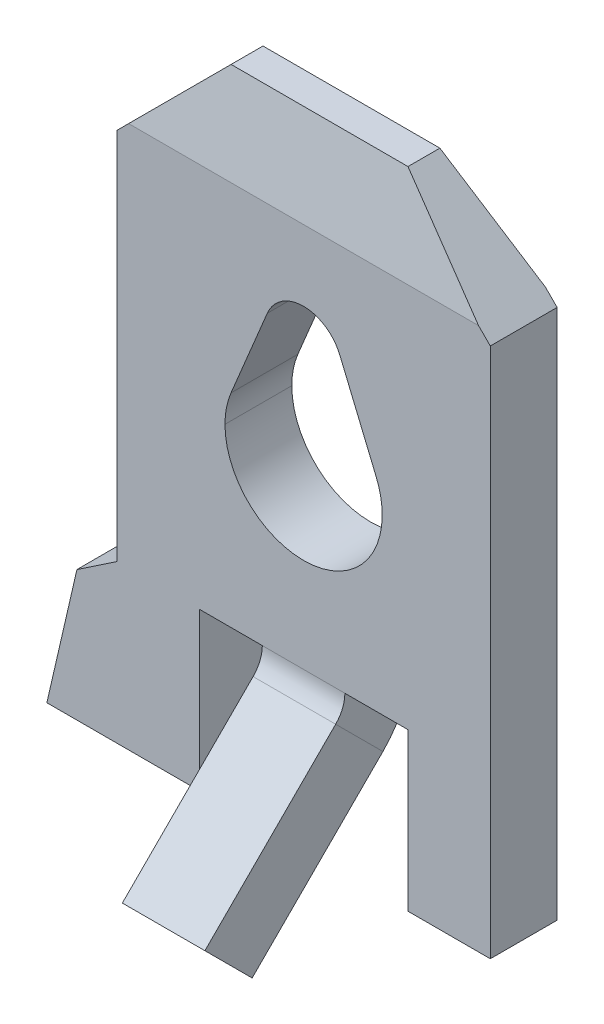
ISO-10303-21;
HEADER;
FILE_DESCRIPTION(('STEP AP214'),'2;1');
FILE_NAME('part.step','',(''),(''),'','','');
FILE_SCHEMA(('AUTOMOTIVE_DESIGN { 1 0 10303 214 1 1 1 1 }'));
ENDSEC;
DATA;
#1=APPLICATION_CONTEXT('core data for automotive mechanical design processes');
#2=APPLICATION_PROTOCOL_DEFINITION('international standard','automotive_design',2000,#1);
#3=PRODUCT_CONTEXT('',#1,'mechanical');
#4=PRODUCT('Part','Part','',(#3));
#5=PRODUCT_RELATED_PRODUCT_CATEGORY('part','',(#4));
#6=PRODUCT_DEFINITION_FORMATION('','',#4);
#7=PRODUCT_DEFINITION_CONTEXT('part definition',#1,'design');
#8=PRODUCT_DEFINITION('design','',#6,#7);
#9=PRODUCT_DEFINITION_SHAPE('','',#8);
#10=(LENGTH_UNIT() NAMED_UNIT(*) SI_UNIT(.MILLI.,.METRE.));
#11=(NAMED_UNIT(*) PLANE_ANGLE_UNIT() SI_UNIT($,.RADIAN.));
#12=(NAMED_UNIT(*) SI_UNIT($,.STERADIAN.) SOLID_ANGLE_UNIT());
#13=UNCERTAINTY_MEASURE_WITH_UNIT(LENGTH_MEASURE(1.E-05),#10,'distance_accuracy_value','');
#14=(GEOMETRIC_REPRESENTATION_CONTEXT(3) GLOBAL_UNCERTAINTY_ASSIGNED_CONTEXT((#13)) GLOBAL_UNIT_ASSIGNED_CONTEXT((#10,
#11,#12)) REPRESENTATION_CONTEXT('',''));
#15=CARTESIAN_POINT('',(0.,0.,0.));
#16=DIRECTION('',(0.,0.,1.));
#17=DIRECTION('',(1.,0.,0.));
#18=AXIS2_PLACEMENT_3D('',#15,#16,#17);
#19=CARTESIAN_POINT('',(0.,2.15,-2.18923148483106));
#20=DIRECTION('',(-0.557844868525012,0.829945240760083,0.));
#21=DIRECTION('',(0.,0.,1.));
#22=AXIS2_PLACEMENT_3D('',#19,#20,#21);
#23=PLANE('',#22);
#24=DIRECTION('',(0.829945240760083,0.557844868525012,0.));
#25=VECTOR('',#24,1.);
#26=CARTESIAN_POINT('',(0.,2.15,0.));
#27=LINE('',#26,#25);
#28=CARTESIAN_POINT('',(-0.507898340442458,1.80861785930754,0.));
#29=VERTEX_POINT('',#28);
#30=CARTESIAN_POINT('',(0.,2.15,0.));
#31=VERTEX_POINT('',#30);
#32=EDGE_CURVE('E388',#29,#31,#27,.T.);
#33=ORIENTED_EDGE('',*,*,#32,.F.);
#34=DIRECTION('',(0.,0.,1.));
#35=VECTOR('',#34,1.);
#36=CARTESIAN_POINT('',(-0.507898340442458,1.80861785930754,-2.18923148483106));
#37=LINE('',#36,#35);
#38=CARTESIAN_POINT('',(-0.507898340442458,1.80861785930754,0.85));
#39=VERTEX_POINT('',#38);
#40=EDGE_CURVE('E11',#29,#39,#37,.T.);
#41=ORIENTED_EDGE('',*,*,#40,.T.);
#42=DIRECTION('',(-0.829945240760083,-0.557844868525012,0.));
#43=VECTOR('',#42,1.);
#44=CARTESIAN_POINT('',(0.,2.15,0.85));
#45=LINE('',#44,#43);
#46=CARTESIAN_POINT('',(0.,2.15,0.85));
#47=VERTEX_POINT('',#46);
#48=EDGE_CURVE('E365',#47,#39,#45,.T.);
#49=ORIENTED_EDGE('',*,*,#48,.F.);
#50=DIRECTION('',(0.,0.,1.));
#51=VECTOR('',#50,1.);
#52=CARTESIAN_POINT('',(0.,2.15,-2.18923148483106));
#53=LINE('',#52,#51);
#54=EDGE_CURVE('E271',#31,#47,#53,.T.);
#55=ORIENTED_EDGE('',*,*,#54,.F.);
#56=EDGE_LOOP('',(#33,#41,#49,#55));
#57=FACE_BOUND('',#56,.T.);
#58=ADVANCED_FACE('F16',(#57),#23,.T.);
#59=CARTESIAN_POINT('',(-0.507898340442458,1.80861785930754,-2.18923148483106));
#60=DIRECTION('',(-0.974429787531596,0.224692209858572,0.));
#61=DIRECTION('',(0.,0.,1.));
#62=AXIS2_PLACEMENT_3D('',#59,#60,#61);
#63=PLANE('',#62);
#64=DIRECTION('',(0.224692209858572,0.974429787531596,0.));
#65=VECTOR('',#64,1.);
#66=CARTESIAN_POINT('',(-0.507898340442458,1.80861785930754,0.));
#67=LINE('',#66,#65);
#68=CARTESIAN_POINT('',(-0.890356386047537,0.149999999999998,0.));
#69=VERTEX_POINT('',#68);
#70=EDGE_CURVE('E384',#69,#29,#67,.T.);
#71=ORIENTED_EDGE('',*,*,#70,.F.);
#72=DIRECTION('',(0.,0.,1.));
#73=VECTOR('',#72,1.);
#74=CARTESIAN_POINT('',(-0.890356386047537,0.149999999999998,-2.18923148483106));
#75=LINE('',#74,#73);
#76=CARTESIAN_POINT('',(-0.890356386047537,0.149999999999998,0.85));
#77=VERTEX_POINT('',#76);
#78=EDGE_CURVE('E305',#69,#77,#75,.T.);
#79=ORIENTED_EDGE('',*,*,#78,.T.);
#80=DIRECTION('',(-0.224692209858572,-0.974429787531596,0.));
#81=VECTOR('',#80,1.);
#82=CARTESIAN_POINT('',(-0.507898340442458,1.80861785930754,0.85));
#83=LINE('',#82,#81);
#84=EDGE_CURVE('E360',#39,#77,#83,.T.);
#85=ORIENTED_EDGE('',*,*,#84,.F.);
#86=ORIENTED_EDGE('',*,*,#40,.F.);
#87=EDGE_LOOP('',(#71,#79,#85,#86));
#88=FACE_BOUND('',#87,.T.);
#89=ADVANCED_FACE('F1168',(#88),#63,.T.);
#90=CARTESIAN_POINT('',(2.9,3.84848421169575,2.03213960570058));
#91=DIRECTION('',(-1.,0.,0.));
#92=DIRECTION('',(0.,0.,1.));
#93=AXIS2_PLACEMENT_3D('',#90,#91,#92);
#94=PLANE('',#93);
#95=DIRECTION('',(0.,-0.707106781186544,-0.707106781186551));
#96=VECTOR('',#95,1.);
#97=CARTESIAN_POINT('',(2.9,3.39031190869815,2.49031190869817));
#98=LINE('',#97,#96);
#99=CARTESIAN_POINT('',(2.9,1.86715728752538,0.96715728752538));
#100=VERTEX_POINT('',#99);
#101=CARTESIAN_POINT('',(2.9,1.26611652351681,0.366116523516817));
#102=VERTEX_POINT('',#101);
#103=EDGE_CURVE('E298',#100,#102,#98,.T.);
#104=ORIENTED_EDGE('',*,*,#103,.F.);
#105=DIRECTION('',(0.,-0.707106781186547,0.707106781186549));
#106=VECTOR('',#105,1.);
#107=CARTESIAN_POINT('',(2.9,2.32532959052296,0.508984984527799));
#108=LINE('',#107,#106);
#109=CARTESIAN_POINT('',(2.9,0.204009246963322,2.63030532808745));
#110=VERTEX_POINT('',#109);
#111=EDGE_CURVE('E379',#100,#110,#108,.T.);
#112=ORIENTED_EDGE('',*,*,#111,.T.);
#113=DIRECTION('',(0.,0.707106781186549,0.707106781186546));
#114=VECTOR('',#113,1.);
#115=CARTESIAN_POINT('',(2.9,-0.397031517045243,2.02926456407888));
#116=LINE('',#115,#114);
#117=CARTESIAN_POINT('',(2.9,-0.397031517045243,2.02926456407888));
#118=VERTEX_POINT('',#117);
#119=EDGE_CURVE('E417',#118,#110,#116,.T.);
#120=ORIENTED_EDGE('',*,*,#119,.F.);
#121=DIRECTION('',(0.,0.707106781186547,-0.707106781186549));
#122=VECTOR('',#121,1.);
#123=CARTESIAN_POINT('',(2.9,1.72428882651439,-0.0920557794807646));
#124=LINE('',#123,#122);
#125=EDGE_CURVE('E27',#118,#102,#124,.T.);
#126=ORIENTED_EDGE('',*,*,#125,.T.);
#127=EDGE_LOOP('',(#104,#112,#120,#126));
#128=FACE_BOUND('',#127,.T.);
#129=ADVANCED_FACE('F1173',(#128),#94,.F.);
#130=CARTESIAN_POINT('',(4.75,0.310075264141302,1.32215778289233));
#131=DIRECTION('',(0.,0.707106781186549,0.707106781186547));
#132=DIRECTION('',(1.,0.,0.));
#133=AXIS2_PLACEMENT_3D('',#130,#131,#132);
#134=PLANE('',#133);
#135=DIRECTION('',(-1.,0.,0.));
#136=VECTOR('',#135,1.);
#137=CARTESIAN_POINT('',(4.75,1.26611652351682,0.366116523516815));
#138=LINE('',#137,#136);
#139=CARTESIAN_POINT('',(1.85,1.26611652351682,0.366116523516817));
#140=VERTEX_POINT('',#139);
#141=EDGE_CURVE('E489',#102,#140,#138,.T.);
#142=ORIENTED_EDGE('',*,*,#141,.F.);
#143=ORIENTED_EDGE('',*,*,#125,.F.);
#144=DIRECTION('',(1.,0.,0.));
#145=VECTOR('',#144,1.);
#146=CARTESIAN_POINT('',(1.85,-0.397031517045243,2.02926456407888));
#147=LINE('',#146,#145);
#148=CARTESIAN_POINT('',(1.85,-0.397031517045243,2.02926456407888));
#149=VERTEX_POINT('',#148);
#150=EDGE_CURVE('E503',#149,#118,#147,.T.);
#151=ORIENTED_EDGE('',*,*,#150,.F.);
#152=DIRECTION('',(0.,-0.707106781186547,0.707106781186549));
#153=VECTOR('',#152,1.);
#154=CARTESIAN_POINT('',(1.85,1.72428882651439,-0.0920557794807644));
#155=LINE('',#154,#153);
#156=EDGE_CURVE('E42',#140,#149,#155,.T.);
#157=ORIENTED_EDGE('',*,*,#156,.F.);
#158=EDGE_LOOP('',(#142,#143,#151,#157));
#159=FACE_BOUND('',#158,.T.);
#160=ADVANCED_FACE('F1187',(#159),#134,.F.);
#161=CARTESIAN_POINT('',(1.85,3.84848421169575,2.03213960570058));
#162=DIRECTION('',(1.,0.,0.));
#163=DIRECTION('',(0.,0.,-1.));
#164=AXIS2_PLACEMENT_3D('',#161,#162,#163);
#165=PLANE('',#164);
#166=DIRECTION('',(0.,0.707106781186544,0.707106781186551));
#167=VECTOR('',#166,1.);
#168=CARTESIAN_POINT('',(1.85,3.39031190869815,2.49031190869817));
#169=LINE('',#168,#167);
#170=CARTESIAN_POINT('',(1.85,1.86715728752538,0.967157287525381));
#171=VERTEX_POINT('',#170);
#172=EDGE_CURVE('E376',#140,#171,#169,.T.);
#173=ORIENTED_EDGE('',*,*,#172,.F.);
#174=ORIENTED_EDGE('',*,*,#156,.T.);
#175=DIRECTION('',(0.,-0.707106781186549,-0.707106781186546));
#176=VECTOR('',#175,1.);
#177=CARTESIAN_POINT('',(1.85,0.204009246963322,2.63030532808745));
#178=LINE('',#177,#176);
#179=CARTESIAN_POINT('',(1.85,0.204009246963322,2.63030532808745));
#180=VERTEX_POINT('',#179);
#181=EDGE_CURVE('E416',#180,#149,#178,.T.);
#182=ORIENTED_EDGE('',*,*,#181,.F.);
#183=DIRECTION('',(0.,0.707106781186547,-0.707106781186549));
#184=VECTOR('',#183,1.);
#185=CARTESIAN_POINT('',(1.85,2.32532959052296,0.5089849845278));
#186=LINE('',#185,#184);
#187=EDGE_CURVE('E504',#180,#171,#186,.T.);
#188=ORIENTED_EDGE('',*,*,#187,.T.);
#189=EDGE_LOOP('',(#173,#174,#182,#188));
#190=FACE_BOUND('',#189,.T.);
#191=ADVANCED_FACE('F561',(#190),#165,.F.);
#192=CARTESIAN_POINT('',(4.75,5.79015281833704,-2.95583824328629));
#193=DIRECTION('',(0.,-0.707106781186549,-0.707106781186547));
#194=DIRECTION('',(0.,0.707106781186547,-0.707106781186549));
#195=AXIS2_PLACEMENT_3D('',#192,#193,#194);
#196=PLANE('',#195);
#197=DIRECTION('',(1.,0.,0.));
#198=VECTOR('',#197,1.);
#199=CARTESIAN_POINT('',(4.75,1.86715728752538,0.967157287525383));
#200=LINE('',#199,#198);
#201=EDGE_CURVE('E488',#171,#100,#200,.T.);
#202=ORIENTED_EDGE('',*,*,#201,.F.);
#203=ORIENTED_EDGE('',*,*,#187,.F.);
#204=DIRECTION('',(-1.,0.,0.));
#205=VECTOR('',#204,1.);
#206=CARTESIAN_POINT('',(2.9,0.204009246963322,2.63030532808745));
#207=LINE('',#206,#205);
#208=EDGE_CURVE('E412',#110,#180,#207,.T.);
#209=ORIENTED_EDGE('',*,*,#208,.F.);
#210=ORIENTED_EDGE('',*,*,#111,.F.);
#211=EDGE_LOOP('',(#202,#203,#209,#210));
#212=FACE_BOUND('',#211,.T.);
#213=ADVANCED_FACE('F565',(#212),#196,.F.);
#214=CARTESIAN_POINT('',(0.,-0.397031517045243,2.02926456407888));
#215=DIRECTION('',(0.,-0.707106781186546,0.707106781186549));
#216=DIRECTION('',(-1.,0.,0.));
#217=AXIS2_PLACEMENT_3D('',#214,#215,#216);
#218=PLANE('',#217);
#219=ORIENTED_EDGE('',*,*,#119,.T.);
#220=ORIENTED_EDGE('',*,*,#208,.T.);
#221=ORIENTED_EDGE('',*,*,#181,.T.);
#222=ORIENTED_EDGE('',*,*,#150,.T.);
#223=EDGE_LOOP('',(#219,#220,#221,#222));
#224=FACE_BOUND('',#223,.T.);
#225=ADVANCED_FACE('F1180',(#224),#218,.T.);
#226=CARTESIAN_POINT('',(0.876719746353102,2.15,1.25));
#227=DIRECTION('',(1.,0.,0.));
#228=DIRECTION('',(0.,1.,0.));
#229=AXIS2_PLACEMENT_3D('',#226,#227,#228);
#230=CYLINDRICAL_SURFACE('',#229,1.25);
#231=CARTESIAN_POINT('',(2.9,2.15,1.25));
#232=DIRECTION('',(1.,0.,0.));
#233=DIRECTION('',(0.,1.,0.));
#234=AXIS2_PLACEMENT_3D('',#231,#232,#233);
#235=CIRCLE('',#234,1.25);
#236=CARTESIAN_POINT('',(2.9,2.15,0.));
#237=VERTEX_POINT('',#236);
#238=EDGE_CURVE('E404',#102,#237,#235,.T.);
#239=ORIENTED_EDGE('',*,*,#238,.F.);
#240=ORIENTED_EDGE('',*,*,#141,.T.);
#241=CARTESIAN_POINT('',(1.85,2.15,1.25));
#242=DIRECTION('',(-1.,0.,0.));
#243=DIRECTION('',(0.,1.,0.));
#244=AXIS2_PLACEMENT_3D('',#241,#242,#243);
#245=CIRCLE('',#244,1.25);
#246=CARTESIAN_POINT('',(1.85,2.15,0.));
#247=VERTEX_POINT('',#246);
#248=EDGE_CURVE('E372',#247,#140,#245,.T.);
#249=ORIENTED_EDGE('',*,*,#248,.F.);
#250=DIRECTION('',(-1.,0.,0.));
#251=VECTOR('',#250,1.);
#252=CARTESIAN_POINT('',(4.75,2.15,0.));
#253=LINE('',#252,#251);
#254=EDGE_CURVE('E499',#237,#247,#253,.T.);
#255=ORIENTED_EDGE('',*,*,#254,.F.);
#256=EDGE_LOOP('',(#239,#240,#249,#255));
#257=FACE_BOUND('',#256,.T.);
#258=ADVANCED_FACE('F1183',(#257),#230,.T.);
#259=CARTESIAN_POINT('',(0.876719746353102,2.15,1.25));
#260=DIRECTION('',(1.,0.,0.));
#261=DIRECTION('',(0.,1.,0.));
#262=AXIS2_PLACEMENT_3D('',#259,#260,#261);
#263=CYLINDRICAL_SURFACE('',#262,0.4);
#264=CARTESIAN_POINT('',(2.9,2.15,1.25));
#265=DIRECTION('',(1.,0.,0.));
#266=DIRECTION('',(0.,0.,1.));
#267=AXIS2_PLACEMENT_3D('',#264,#265,#266);
#268=CIRCLE('',#267,0.4);
#269=CARTESIAN_POINT('',(2.9,2.15,0.85));
#270=VERTEX_POINT('',#269);
#271=EDGE_CURVE('E406',#100,#270,#268,.T.);
#272=ORIENTED_EDGE('',*,*,#271,.T.);
#273=DIRECTION('',(1.,0.,0.));
#274=VECTOR('',#273,1.);
#275=CARTESIAN_POINT('',(4.75,2.15,0.85));
#276=LINE('',#275,#274);
#277=CARTESIAN_POINT('',(1.85,2.15,0.85));
#278=VERTEX_POINT('',#277);
#279=EDGE_CURVE('E340',#278,#270,#276,.T.);
#280=ORIENTED_EDGE('',*,*,#279,.F.);
#281=CARTESIAN_POINT('',(1.85,2.15,1.25));
#282=DIRECTION('',(-1.,0.,0.));
#283=DIRECTION('',(0.,1.,0.));
#284=AXIS2_PLACEMENT_3D('',#281,#282,#283);
#285=CIRCLE('',#284,0.4);
#286=EDGE_CURVE('E550',#278,#171,#285,.T.);
#287=ORIENTED_EDGE('',*,*,#286,.T.);
#288=ORIENTED_EDGE('',*,*,#201,.T.);
#289=EDGE_LOOP('',(#272,#280,#287,#288));
#290=FACE_BOUND('',#289,.T.);
#291=ADVANCED_FACE('F569',(#290),#263,.F.);
#292=CARTESIAN_POINT('',(2.9,2.15,1.25));
#293=DIRECTION('',(-1.,0.,0.));
#294=DIRECTION('',(0.,0.,1.));
#295=AXIS2_PLACEMENT_3D('',#292,#293,#294);
#296=PLANE('',#295);
#297=ORIENTED_EDGE('',*,*,#103,.T.);
#298=ORIENTED_EDGE('',*,*,#238,.T.);
#299=DIRECTION('',(0.,0.,-1.));
#300=VECTOR('',#299,1.);
#301=CARTESIAN_POINT('',(2.9,2.15,3.0040659228538));
#302=LINE('',#301,#300);
#303=EDGE_CURVE('E371',#270,#237,#302,.T.);
#304=ORIENTED_EDGE('',*,*,#303,.F.);
#305=ORIENTED_EDGE('',*,*,#271,.F.);
#306=EDGE_LOOP('',(#297,#298,#304,#305));
#307=FACE_BOUND('',#306,.T.);
#308=ADVANCED_FACE('F1177',(#307),#296,.F.);
#309=CARTESIAN_POINT('',(1.85,2.15,1.25));
#310=DIRECTION('',(1.,0.,0.));
#311=DIRECTION('',(0.,-1.,0.));
#312=AXIS2_PLACEMENT_3D('',#309,#310,#311);
#313=PLANE('',#312);
#314=DIRECTION('',(0.,0.,-1.));
#315=VECTOR('',#314,1.);
#316=CARTESIAN_POINT('',(1.85,2.15,3.0040659228538));
#317=LINE('',#316,#315);
#318=EDGE_CURVE('E370',#278,#247,#317,.T.);
#319=ORIENTED_EDGE('',*,*,#318,.T.);
#320=ORIENTED_EDGE('',*,*,#248,.T.);
#321=ORIENTED_EDGE('',*,*,#172,.T.);
#322=ORIENTED_EDGE('',*,*,#286,.F.);
#323=EDGE_LOOP('',(#319,#320,#321,#322));
#324=FACE_BOUND('',#323,.T.);
#325=ADVANCED_FACE('F558',(#324),#313,.F.);
#326=CARTESIAN_POINT('',(1.05,2.15,3.0040659228538));
#327=DIRECTION('',(-1.,0.,0.));
#328=DIRECTION('',(0.,0.,1.));
#329=AXIS2_PLACEMENT_3D('',#326,#327,#328);
#330=PLANE('',#329);
#331=DIRECTION('',(0.,-1.,0.));
#332=VECTOR('',#331,1.);
#333=CARTESIAN_POINT('',(1.05,2.15,0.85));
#334=LINE('',#333,#332);
#335=CARTESIAN_POINT('',(1.05,2.15,0.85));
#336=VERTEX_POINT('',#335);
#337=CARTESIAN_POINT('',(1.05,0.15,0.85));
#338=VERTEX_POINT('',#337);
#339=EDGE_CURVE('E434',#336,#338,#334,.T.);
#340=ORIENTED_EDGE('',*,*,#339,.T.);
#341=DIRECTION('',(0.,0.,-1.));
#342=VECTOR('',#341,1.);
#343=CARTESIAN_POINT('',(1.05,0.149999999999999,3.0040659228538));
#344=LINE('',#343,#342);
#345=CARTESIAN_POINT('',(1.05,0.15,0.));
#346=VERTEX_POINT('',#345);
#347=EDGE_CURVE('E310',#338,#346,#344,.T.);
#348=ORIENTED_EDGE('',*,*,#347,.T.);
#349=DIRECTION('',(0.,1.,0.));
#350=VECTOR('',#349,1.);
#351=CARTESIAN_POINT('',(1.05,2.15,0.));
#352=LINE('',#351,#350);
#353=CARTESIAN_POINT('',(1.05,2.15,0.));
#354=VERTEX_POINT('',#353);
#355=EDGE_CURVE('E510',#346,#354,#352,.T.);
#356=ORIENTED_EDGE('',*,*,#355,.T.);
#357=DIRECTION('',(0.,0.,-1.));
#358=VECTOR('',#357,1.);
#359=CARTESIAN_POINT('',(1.05,2.15,3.0040659228538));
#360=LINE('',#359,#358);
#361=EDGE_CURVE('E366',#336,#354,#360,.T.);
#362=ORIENTED_EDGE('',*,*,#361,.F.);
#363=EDGE_LOOP('',(#340,#348,#356,#362));
#364=FACE_BOUND('',#363,.T.);
#365=ADVANCED_FACE('F1225',(#364),#330,.F.);
#366=CARTESIAN_POINT('',(1.85,2.15,3.0040659228538));
#367=DIRECTION('',(0.,1.,0.));
#368=DIRECTION('',(0.,0.,-1.));
#369=AXIS2_PLACEMENT_3D('',#366,#367,#368);
#370=PLANE('',#369);
#371=DIRECTION('',(-1.,0.,0.));
#372=VECTOR('',#371,1.);
#373=CARTESIAN_POINT('',(1.85,2.15,0.85));
#374=LINE('',#373,#372);
#375=EDGE_CURVE('E345',#278,#336,#374,.T.);
#376=ORIENTED_EDGE('',*,*,#375,.T.);
#377=ORIENTED_EDGE('',*,*,#361,.T.);
#378=DIRECTION('',(1.,0.,0.));
#379=VECTOR('',#378,1.);
#380=CARTESIAN_POINT('',(1.85,2.15,0.));
#381=LINE('',#380,#379);
#382=EDGE_CURVE('E513',#354,#247,#381,.T.);
#383=ORIENTED_EDGE('',*,*,#382,.T.);
#384=ORIENTED_EDGE('',*,*,#318,.F.);
#385=EDGE_LOOP('',(#376,#377,#383,#384));
#386=FACE_BOUND('',#385,.T.);
#387=ADVANCED_FACE('F575',(#386),#370,.F.);
#388=CARTESIAN_POINT('',(2.9,2.15,3.0040659228538));
#389=DIRECTION('',(0.,1.,0.));
#390=DIRECTION('',(1.,0.,0.));
#391=AXIS2_PLACEMENT_3D('',#388,#389,#390);
#392=PLANE('',#391);
#393=DIRECTION('',(-1.,0.,0.));
#394=VECTOR('',#393,1.);
#395=CARTESIAN_POINT('',(2.9,2.15,0.85));
#396=LINE('',#395,#394);
#397=CARTESIAN_POINT('',(3.7,2.15,0.85));
#398=VERTEX_POINT('',#397);
#399=EDGE_CURVE('E344',#398,#270,#396,.T.);
#400=ORIENTED_EDGE('',*,*,#399,.T.);
#401=ORIENTED_EDGE('',*,*,#303,.T.);
#402=DIRECTION('',(1.,0.,0.));
#403=VECTOR('',#402,1.);
#404=CARTESIAN_POINT('',(2.9,2.15,0.));
#405=LINE('',#404,#403);
#406=CARTESIAN_POINT('',(3.7,2.15,0.));
#407=VERTEX_POINT('',#406);
#408=EDGE_CURVE('E326',#237,#407,#405,.T.);
#409=ORIENTED_EDGE('',*,*,#408,.T.);
#410=DIRECTION('',(0.,0.,-1.));
#411=VECTOR('',#410,1.);
#412=CARTESIAN_POINT('',(3.7,2.15,3.0040659228538));
#413=LINE('',#412,#411);
#414=EDGE_CURVE('E465',#398,#407,#413,.T.);
#415=ORIENTED_EDGE('',*,*,#414,.F.);
#416=EDGE_LOOP('',(#400,#401,#409,#415));
#417=FACE_BOUND('',#416,.T.);
#418=ADVANCED_FACE('F1191',(#417),#392,.F.);
#419=CARTESIAN_POINT('',(3.7,2.15,3.0040659228538));
#420=DIRECTION('',(1.,0.,0.));
#421=DIRECTION('',(0.,-1.,0.));
#422=AXIS2_PLACEMENT_3D('',#419,#420,#421);
#423=PLANE('',#422);
#424=DIRECTION('',(0.,1.,0.));
#425=VECTOR('',#424,1.);
#426=CARTESIAN_POINT('',(3.7,2.15,0.85));
#427=LINE('',#426,#425);
#428=CARTESIAN_POINT('',(3.7,0.15,0.85));
#429=VERTEX_POINT('',#428);
#430=EDGE_CURVE('E294',#429,#398,#427,.T.);
#431=ORIENTED_EDGE('',*,*,#430,.T.);
#432=ORIENTED_EDGE('',*,*,#414,.T.);
#433=DIRECTION('',(0.,-1.,0.));
#434=VECTOR('',#433,1.);
#435=CARTESIAN_POINT('',(3.7,2.15,0.));
#436=LINE('',#435,#434);
#437=CARTESIAN_POINT('',(3.7,0.15,0.));
#438=VERTEX_POINT('',#437);
#439=EDGE_CURVE('E398',#407,#438,#436,.T.);
#440=ORIENTED_EDGE('',*,*,#439,.T.);
#441=DIRECTION('',(0.,0.,-1.));
#442=VECTOR('',#441,1.);
#443=CARTESIAN_POINT('',(3.7,0.149999999999999,3.0040659228538));
#444=LINE('',#443,#442);
#445=EDGE_CURVE('E193',#429,#438,#444,.T.);
#446=ORIENTED_EDGE('',*,*,#445,.F.);
#447=EDGE_LOOP('',(#431,#432,#440,#446));
#448=FACE_BOUND('',#447,.T.);
#449=ADVANCED_FACE('F1163',(#448),#423,.F.);
#450=CARTESIAN_POINT('',(1.91346153846154,5.84230769230769,-3.44093010681705));
#451=DIRECTION('',(-0.923076923076923,0.384615384615385,0.));
#452=DIRECTION('',(0.,0.,1.));
#453=AXIS2_PLACEMENT_3D('',#450,#451,#452);
#454=PLANE('',#453);
#455=DIRECTION('',(0.384615384615385,0.923076923076923,0.));
#456=VECTOR('',#455,1.);
#457=CARTESIAN_POINT('',(1.91346153846154,5.84230769230769,0.));
#458=LINE('',#457,#456);
#459=CARTESIAN_POINT('',(1.45192307692308,4.73461538461538,0.));
#460=VERTEX_POINT('',#459);
#461=CARTESIAN_POINT('',(1.91346153846154,5.84230769230769,0.));
#462=VERTEX_POINT('',#461);
#463=EDGE_CURVE('E338',#460,#462,#458,.T.);
#464=ORIENTED_EDGE('',*,*,#463,.T.);
#465=DIRECTION('',(0.,0.,1.));
#466=VECTOR('',#465,1.);
#467=CARTESIAN_POINT('',(1.91346153846154,5.84230769230769,-3.44093010681705));
#468=LINE('',#467,#466);
#469=CARTESIAN_POINT('',(1.91346153846154,5.84230769230769,0.85));
#470=VERTEX_POINT('',#469);
#471=EDGE_CURVE('E534',#462,#470,#468,.T.);
#472=ORIENTED_EDGE('',*,*,#471,.T.);
#473=DIRECTION('',(-0.384615384615385,-0.923076923076923,0.));
#474=VECTOR('',#473,1.);
#475=CARTESIAN_POINT('',(1.91346153846154,5.84230769230769,0.85));
#476=LINE('',#475,#474);
#477=CARTESIAN_POINT('',(1.45192307692308,4.73461538461538,0.85));
#478=VERTEX_POINT('',#477);
#479=EDGE_CURVE('E438',#470,#478,#476,.T.);
#480=ORIENTED_EDGE('',*,*,#479,.T.);
#481=DIRECTION('',(0.,0.,1.));
#482=VECTOR('',#481,1.);
#483=CARTESIAN_POINT('',(1.45192307692308,4.73461538461538,-3.44093010681705));
#484=LINE('',#483,#482);
#485=EDGE_CURVE('E468',#460,#478,#484,.T.);
#486=ORIENTED_EDGE('',*,*,#485,.F.);
#487=EDGE_LOOP('',(#464,#472,#480,#486));
#488=FACE_BOUND('',#487,.T.);
#489=ADVANCED_FACE('F1144',(#488),#454,.F.);
#490=CARTESIAN_POINT('',(2.375,4.35,-3.44093010681705));
#491=DIRECTION('',(0.,0.,1.));
#492=DIRECTION('',(1.,0.,0.));
#493=AXIS2_PLACEMENT_3D('',#490,#491,#492);
#494=CYLINDRICAL_SURFACE('',#493,1.);
#495=DIRECTION('',(0.,0.,1.));
#496=VECTOR('',#495,1.);
#497=CARTESIAN_POINT('',(1.375,4.35,-3.44093010681705));
#498=LINE('',#497,#496);
#499=CARTESIAN_POINT('',(1.375,4.35,0.));
#500=VERTEX_POINT('',#499);
#501=CARTESIAN_POINT('',(1.375,4.35,0.85));
#502=VERTEX_POINT('',#501);
#503=EDGE_CURVE('E299',#500,#502,#498,.T.);
#504=ORIENTED_EDGE('',*,*,#503,.F.);
#505=CARTESIAN_POINT('',(2.375,4.35,0.));
#506=DIRECTION('',(0.,0.,-1.));
#507=DIRECTION('',(0.,-1.,0.));
#508=AXIS2_PLACEMENT_3D('',#505,#506,#507);
#509=CIRCLE('',#508,1.);
#510=EDGE_CURVE('E424',#500,#460,#509,.T.);
#511=ORIENTED_EDGE('',*,*,#510,.T.);
#512=ORIENTED_EDGE('',*,*,#485,.T.);
#513=CARTESIAN_POINT('',(2.375,4.35,0.85));
#514=DIRECTION('',(0.,0.,1.));
#515=DIRECTION('',(1.,0.,0.));
#516=AXIS2_PLACEMENT_3D('',#513,#514,#515);
#517=CIRCLE('',#516,1.);
#518=EDGE_CURVE('E239',#478,#502,#517,.T.);
#519=ORIENTED_EDGE('',*,*,#518,.T.);
#520=EDGE_LOOP('',(#504,#511,#512,#519));
#521=FACE_BOUND('',#520,.T.);
#522=ADVANCED_FACE('F1153',(#521),#494,.F.);
#523=CARTESIAN_POINT('',(2.84243697464802,5.82748992853653,-3.44093010681705));
#524=DIRECTION('',(0.922994271128755,0.384813689288075,0.));
#525=DIRECTION('',(0.,0.,-1.));
#526=AXIS2_PLACEMENT_3D('',#523,#524,#525);
#527=PLANE('',#526);
#528=DIRECTION('',(0.384813689288075,-0.922994271128755,0.));
#529=VECTOR('',#528,1.);
#530=CARTESIAN_POINT('',(2.84243697464802,5.82748992853653,0.));
#531=LINE('',#530,#529);
#532=CARTESIAN_POINT('',(2.84243697464802,5.82748992853653,0.));
#533=VERTEX_POINT('',#532);
#534=CARTESIAN_POINT('',(3.29799427112876,4.73481368928808,0.));
#535=VERTEX_POINT('',#534);
#536=EDGE_CURVE('E403',#533,#535,#531,.T.);
#537=ORIENTED_EDGE('',*,*,#536,.T.);
#538=DIRECTION('',(0.,0.,1.));
#539=VECTOR('',#538,1.);
#540=CARTESIAN_POINT('',(3.29799427112876,4.73481368928808,-3.44093010681705));
#541=LINE('',#540,#539);
#542=CARTESIAN_POINT('',(3.29799427112876,4.73481368928808,0.85));
#543=VERTEX_POINT('',#542);
#544=EDGE_CURVE('E317',#535,#543,#541,.T.);
#545=ORIENTED_EDGE('',*,*,#544,.T.);
#546=DIRECTION('',(-0.384813689288075,0.922994271128755,0.));
#547=VECTOR('',#546,1.);
#548=CARTESIAN_POINT('',(2.84243697464802,5.82748992853653,0.85));
#549=LINE('',#548,#547);
#550=CARTESIAN_POINT('',(2.84243697464802,5.82748992853653,0.85));
#551=VERTEX_POINT('',#550);
#552=EDGE_CURVE('E519',#543,#551,#549,.T.);
#553=ORIENTED_EDGE('',*,*,#552,.T.);
#554=DIRECTION('',(0.,0.,1.));
#555=VECTOR('',#554,1.);
#556=CARTESIAN_POINT('',(2.84243697464802,5.82748992853653,-3.44093010681705));
#557=LINE('',#556,#555);
#558=EDGE_CURVE('E479',#533,#551,#557,.T.);
#559=ORIENTED_EDGE('',*,*,#558,.F.);
#560=EDGE_LOOP('',(#537,#545,#553,#559));
#561=FACE_BOUND('',#560,.T.);
#562=ADVANCED_FACE('F1155',(#561),#527,.F.);
#563=CARTESIAN_POINT('',(2.375,5.65,-3.44093010681705));
#564=DIRECTION('',(0.,0.,1.));
#565=DIRECTION('',(1.,0.,0.));
#566=AXIS2_PLACEMENT_3D('',#563,#564,#565);
#567=CYLINDRICAL_SURFACE('',#566,0.5);
#568=CARTESIAN_POINT('',(2.375,5.65,0.));
#569=DIRECTION('',(0.,0.,-1.));
#570=DIRECTION('',(0.,-1.,0.));
#571=AXIS2_PLACEMENT_3D('',#568,#569,#570);
#572=CIRCLE('',#571,0.5);
#573=EDGE_CURVE('E399',#462,#533,#572,.T.);
#574=ORIENTED_EDGE('',*,*,#573,.T.);
#575=ORIENTED_EDGE('',*,*,#558,.T.);
#576=CARTESIAN_POINT('',(2.375,5.65,0.85));
#577=DIRECTION('',(0.,0.,1.));
#578=DIRECTION('',(1.,0.,0.));
#579=AXIS2_PLACEMENT_3D('',#576,#577,#578);
#580=CIRCLE('',#579,0.5);
#581=EDGE_CURVE('E475',#551,#470,#580,.T.);
#582=ORIENTED_EDGE('',*,*,#581,.T.);
#583=ORIENTED_EDGE('',*,*,#471,.F.);
#584=EDGE_LOOP('',(#574,#575,#582,#583));
#585=FACE_BOUND('',#584,.T.);
#586=ADVANCED_FACE('F1148',(#585),#567,.F.);
#587=CARTESIAN_POINT('',(3.5,8.15,-1.76776695296637));
#588=DIRECTION('',(-0.707106781186548,-0.707106781186548,0.));
#589=DIRECTION('',(-0.707106781186548,0.707106781186548,0.));
#590=AXIS2_PLACEMENT_3D('',#587,#588,#589);
#591=PLANE('',#590);
#592=DIRECTION('',(0.,0.,1.));
#593=VECTOR('',#592,1.);
#594=CARTESIAN_POINT('',(3.5,8.15,-1.76776695296637));
#595=LINE('',#594,#593);
#596=CARTESIAN_POINT('',(3.5,8.15,0.24139344262295));
#597=VERTEX_POINT('',#596);
#598=CARTESIAN_POINT('',(3.5,8.15,0.647131147540979));
#599=VERTEX_POINT('',#598);
#600=EDGE_CURVE('E352',#597,#599,#595,.T.);
#601=ORIENTED_EDGE('',*,*,#600,.T.);
#602=DIRECTION('',(-0.70116968993079,0.70116968993079,-0.12931408215937));
#603=VECTOR('',#602,1.);
#604=CARTESIAN_POINT('',(4.11454866759705,7.53545133240295,0.760470041155192));
#605=LINE('',#604,#603);
#606=CARTESIAN_POINT('',(4.6,7.05,0.85));
#607=VERTEX_POINT('',#606);
#608=EDGE_CURVE('E277',#607,#599,#605,.T.);
#609=ORIENTED_EDGE('',*,*,#608,.F.);
#610=DIRECTION('',(0.707106781186548,-0.707106781186548,0.));
#611=VECTOR('',#610,1.);
#612=CARTESIAN_POINT('',(3.5,8.15,0.85));
#613=LINE('',#612,#611);
#614=CARTESIAN_POINT('',(4.75,6.9,0.85));
#615=VERTEX_POINT('',#614);
#616=EDGE_CURVE('E274',#607,#615,#613,.T.);
#617=ORIENTED_EDGE('',*,*,#616,.T.);
#618=DIRECTION('',(0.,0.,1.));
#619=VECTOR('',#618,1.);
#620=CARTESIAN_POINT('',(4.75,6.9,-1.76776695296637));
#621=LINE('',#620,#619);
#622=CARTESIAN_POINT('',(4.75,6.9,0.));
#623=VERTEX_POINT('',#622);
#624=EDGE_CURVE('E259',#623,#615,#621,.T.);
#625=ORIENTED_EDGE('',*,*,#624,.F.);
#626=DIRECTION('',(-0.707106781186548,0.707106781186548,0.));
#627=VECTOR('',#626,1.);
#628=CARTESIAN_POINT('',(3.5,8.15,0.));
#629=LINE('',#628,#627);
#630=CARTESIAN_POINT('',(4.6,7.05,0.));
#631=VERTEX_POINT('',#630);
#632=EDGE_CURVE('E356',#623,#631,#629,.T.);
#633=ORIENTED_EDGE('',*,*,#632,.T.);
#634=DIRECTION('',(0.698744344369524,-0.698744344369524,-0.153338457091523));
#635=VECTOR('',#634,1.);
#636=CARTESIAN_POINT('',(4.67323654881826,6.97676345118174,-0.0160716569500576));
#637=LINE('',#636,#635);
#638=EDGE_CURVE('E315',#597,#631,#637,.T.);
#639=ORIENTED_EDGE('',*,*,#638,.F.);
#640=EDGE_LOOP('',(#601,#609,#617,#625,#633,#639));
#641=FACE_BOUND('',#640,.T.);
#642=ADVANCED_FACE('F276',(#641),#591,.F.);
#643=CARTESIAN_POINT('',(0.,6.9,-1.76776695296637));
#644=DIRECTION('',(0.707106781186548,-0.707106781186548,0.));
#645=DIRECTION('',(0.,0.,-1.));
#646=AXIS2_PLACEMENT_3D('',#643,#644,#645);
#647=PLANE('',#646);
#648=DIRECTION('',(-0.707106781186548,-0.707106781186548,0.));
#649=VECTOR('',#648,1.);
#650=CARTESIAN_POINT('',(0.,6.9,0.));
#651=LINE('',#650,#649);
#652=CARTESIAN_POINT('',(0.15,7.05,0.));
#653=VERTEX_POINT('',#652);
#654=CARTESIAN_POINT('',(0.,6.9,0.));
#655=VERTEX_POINT('',#654);
#656=EDGE_CURVE('E464',#653,#655,#651,.T.);
#657=ORIENTED_EDGE('',*,*,#656,.T.);
#658=DIRECTION('',(0.,0.,1.));
#659=VECTOR('',#658,1.);
#660=CARTESIAN_POINT('',(0.,6.9,-1.76776695296637));
#661=LINE('',#660,#659);
#662=CARTESIAN_POINT('',(0.,6.9,0.85));
#663=VERTEX_POINT('',#662);
#664=EDGE_CURVE('E476',#655,#663,#661,.T.);
#665=ORIENTED_EDGE('',*,*,#664,.T.);
#666=DIRECTION('',(0.707106781186548,0.707106781186548,0.));
#667=VECTOR('',#666,1.);
#668=CARTESIAN_POINT('',(0.,6.9,0.85));
#669=LINE('',#668,#667);
#670=CARTESIAN_POINT('',(0.15,7.05,0.85));
#671=VERTEX_POINT('',#670);
#672=EDGE_CURVE('E351',#663,#671,#669,.T.);
#673=ORIENTED_EDGE('',*,*,#672,.T.);
#674=DIRECTION('',(-0.70116968993079,-0.70116968993079,0.12931408215937));
#675=VECTOR('',#674,1.);
#676=CARTESIAN_POINT('',(2.97073626927174,9.87073626927174,0.329782245421185));
#677=LINE('',#676,#675);
#678=CARTESIAN_POINT('',(1.25,8.15,0.647131147540979));
#679=VERTEX_POINT('',#678);
#680=EDGE_CURVE('E355',#679,#671,#677,.T.);
#681=ORIENTED_EDGE('',*,*,#680,.F.);
#682=DIRECTION('',(0.,0.,1.));
#683=VECTOR('',#682,1.);
#684=CARTESIAN_POINT('',(1.25,8.15,-1.76776695296637));
#685=LINE('',#684,#683);
#686=CARTESIAN_POINT('',(1.25,8.15,0.24139344262295));
#687=VERTEX_POINT('',#686);
#688=EDGE_CURVE('E311',#687,#679,#685,.T.);
#689=ORIENTED_EDGE('',*,*,#688,.F.);
#690=DIRECTION('',(0.698744344369524,0.698744344369524,0.153338457091523));
#691=VECTOR('',#690,1.);
#692=CARTESIAN_POINT('',(2.39592083042662,9.29592083042662,0.492864146468432));
#693=LINE('',#692,#691);
#694=EDGE_CURVE('E309',#653,#687,#693,.T.);
#695=ORIENTED_EDGE('',*,*,#694,.F.);
#696=EDGE_LOOP('',(#657,#665,#673,#681,#689,#695));
#697=FACE_BOUND('',#696,.T.);
#698=ADVANCED_FACE('F787',(#697),#647,.F.);
#699=CARTESIAN_POINT('',(0.,0.,0.));
#700=DIRECTION('',(1.,0.,0.));
#701=DIRECTION('',(0.,1.,0.));
#702=AXIS2_PLACEMENT_3D('',#699,#700,#701);
#703=PLANE('',#702);
#704=DIRECTION('',(0.,1.,0.));
#705=VECTOR('',#704,1.);
#706=CARTESIAN_POINT('',(0.,0.15,0.));
#707=LINE('',#706,#705);
#708=EDGE_CURVE('E20',#31,#655,#707,.T.);
#709=ORIENTED_EDGE('',*,*,#708,.F.);
#710=ORIENTED_EDGE('',*,*,#54,.T.);
#711=DIRECTION('',(0.,-1.,0.));
#712=VECTOR('',#711,1.);
#713=CARTESIAN_POINT('',(0.,7.05,0.85));
#714=LINE('',#713,#712);
#715=EDGE_CURVE('E383',#663,#47,#714,.T.);
#716=ORIENTED_EDGE('',*,*,#715,.F.);
#717=ORIENTED_EDGE('',*,*,#664,.F.);
#718=EDGE_LOOP('',(#709,#710,#716,#717));
#719=FACE_BOUND('',#718,.T.);
#720=ADVANCED_FACE('F778',(#719),#703,.F.);
#721=CARTESIAN_POINT('',(4.75,0.,0.));
#722=DIRECTION('',(1.,0.,0.));
#723=DIRECTION('',(0.,1.,0.));
#724=AXIS2_PLACEMENT_3D('',#721,#722,#723);
#725=PLANE('',#724);
#726=ORIENTED_EDGE('',*,*,#624,.T.);
#727=DIRECTION('',(0.,-1.,0.));
#728=VECTOR('',#727,1.);
#729=CARTESIAN_POINT('',(4.75,7.05,0.85));
#730=LINE('',#729,#728);
#731=CARTESIAN_POINT('',(4.75,0.15,0.85));
#732=VERTEX_POINT('',#731);
#733=EDGE_CURVE('E263',#615,#732,#730,.T.);
#734=ORIENTED_EDGE('',*,*,#733,.T.);
#735=DIRECTION('',(0.,0.,-1.));
#736=VECTOR('',#735,1.);
#737=CARTESIAN_POINT('',(4.75,0.15,0.));
#738=LINE('',#737,#736);
#739=CARTESIAN_POINT('',(4.75,0.15,0.));
#740=VERTEX_POINT('',#739);
#741=EDGE_CURVE('E207',#732,#740,#738,.T.);
#742=ORIENTED_EDGE('',*,*,#741,.T.);
#743=DIRECTION('',(0.,1.,0.));
#744=VECTOR('',#743,1.);
#745=CARTESIAN_POINT('',(4.75,0.15,0.));
#746=LINE('',#745,#744);
#747=EDGE_CURVE('E266',#740,#623,#746,.T.);
#748=ORIENTED_EDGE('',*,*,#747,.T.);
#749=EDGE_LOOP('',(#726,#734,#742,#748));
#750=FACE_BOUND('',#749,.T.);
#751=ADVANCED_FACE('F261',(#750),#725,.T.);
#752=CARTESIAN_POINT('',(4.75,0.15,0.));
#753=DIRECTION('',(0.,1.,0.));
#754=DIRECTION('',(1.,0.,0.));
#755=AXIS2_PLACEMENT_3D('',#752,#753,#754);
#756=PLANE('',#755);
#757=DIRECTION('',(-1.,0.,0.));
#758=VECTOR('',#757,1.);
#759=CARTESIAN_POINT('',(4.75,0.15,0.85));
#760=LINE('',#759,#758);
#761=EDGE_CURVE('E287',#732,#429,#760,.T.);
#762=ORIENTED_EDGE('',*,*,#761,.T.);
#763=ORIENTED_EDGE('',*,*,#445,.T.);
#764=DIRECTION('',(-1.,0.,0.));
#765=VECTOR('',#764,1.);
#766=CARTESIAN_POINT('',(4.75,0.15,0.));
#767=LINE('',#766,#765);
#768=EDGE_CURVE('E394',#740,#438,#767,.T.);
#769=ORIENTED_EDGE('',*,*,#768,.F.);
#770=ORIENTED_EDGE('',*,*,#741,.F.);
#771=EDGE_LOOP('',(#762,#763,#769,#770));
#772=FACE_BOUND('',#771,.T.);
#773=ADVANCED_FACE('F1272',(#772),#756,.F.);
#774=CARTESIAN_POINT('',(4.75,8.15,0.647131147540979));
#775=DIRECTION('',(0.,-0.181367589437408,-0.983415373838371));
#776=DIRECTION('',(0.,-0.983415373838371,0.181367589437408));
#777=AXIS2_PLACEMENT_3D('',#774,#775,#776);
#778=PLANE('',#777);
#779=DIRECTION('',(-1.,0.,0.));
#780=VECTOR('',#779,1.);
#781=CARTESIAN_POINT('',(4.75,8.15,0.647131147540979));
#782=LINE('',#781,#780);
#783=EDGE_CURVE('E314',#599,#679,#782,.T.);
#784=ORIENTED_EDGE('',*,*,#783,.T.);
#785=ORIENTED_EDGE('',*,*,#680,.T.);
#786=DIRECTION('',(-1.,0.,0.));
#787=VECTOR('',#786,1.);
#788=CARTESIAN_POINT('',(4.75,7.05,0.85));
#789=LINE('',#788,#787);
#790=EDGE_CURVE('E282',#607,#671,#789,.T.);
#791=ORIENTED_EDGE('',*,*,#790,.F.);
#792=ORIENTED_EDGE('',*,*,#608,.T.);
#793=EDGE_LOOP('',(#784,#785,#791,#792));
#794=FACE_BOUND('',#793,.T.);
#795=ADVANCED_FACE('F1268',(#794),#778,.F.);
#796=CARTESIAN_POINT('',(4.75,8.15,0.24139344262295));
#797=DIRECTION('',(0.,-1.,0.));
#798=DIRECTION('',(0.,0.,-1.));
#799=AXIS2_PLACEMENT_3D('',#796,#797,#798);
#800=PLANE('',#799);
#801=DIRECTION('',(-1.,0.,0.));
#802=VECTOR('',#801,1.);
#803=CARTESIAN_POINT('',(4.75,8.15,0.24139344262295));
#804=LINE('',#803,#802);
#805=EDGE_CURVE('E392',#597,#687,#804,.T.);
#806=ORIENTED_EDGE('',*,*,#805,.T.);
#807=ORIENTED_EDGE('',*,*,#688,.T.);
#808=ORIENTED_EDGE('',*,*,#783,.F.);
#809=ORIENTED_EDGE('',*,*,#600,.F.);
#810=EDGE_LOOP('',(#806,#807,#808,#809));
#811=FACE_BOUND('',#810,.T.);
#812=ADVANCED_FACE('F1216',(#811),#800,.F.);
#813=CARTESIAN_POINT('',(4.75,7.05,0.));
#814=DIRECTION('',(0.,-0.214348018272916,0.976757353216485));
#815=DIRECTION('',(-1.,0.,0.));
#816=AXIS2_PLACEMENT_3D('',#813,#814,#815);
#817=PLANE('',#816);
#818=DIRECTION('',(-1.,0.,0.));
#819=VECTOR('',#818,1.);
#820=CARTESIAN_POINT('',(4.75,7.05,0.));
#821=LINE('',#820,#819);
#822=EDGE_CURVE('E359',#631,#653,#821,.T.);
#823=ORIENTED_EDGE('',*,*,#822,.T.);
#824=ORIENTED_EDGE('',*,*,#694,.T.);
#825=ORIENTED_EDGE('',*,*,#805,.F.);
#826=ORIENTED_EDGE('',*,*,#638,.T.);
#827=EDGE_LOOP('',(#823,#824,#825,#826));
#828=FACE_BOUND('',#827,.T.);
#829=ADVANCED_FACE('F1210',(#828),#817,.F.);
#830=CARTESIAN_POINT('',(4.75,0.15,0.));
#831=DIRECTION('',(0.,1.,0.));
#832=DIRECTION('',(1.,0.,0.));
#833=AXIS2_PLACEMENT_3D('',#830,#831,#832);
#834=PLANE('',#833);
#835=DIRECTION('',(-1.,0.,0.));
#836=VECTOR('',#835,1.);
#837=CARTESIAN_POINT('',(4.75,0.15,0.));
#838=LINE('',#837,#836);
#839=EDGE_CURVE('E389',#346,#69,#838,.T.);
#840=ORIENTED_EDGE('',*,*,#839,.F.);
#841=ORIENTED_EDGE('',*,*,#347,.F.);
#842=DIRECTION('',(-1.,0.,0.));
#843=VECTOR('',#842,1.);
#844=CARTESIAN_POINT('',(4.75,0.15,0.85));
#845=LINE('',#844,#843);
#846=EDGE_CURVE('E364',#338,#77,#845,.T.);
#847=ORIENTED_EDGE('',*,*,#846,.T.);
#848=ORIENTED_EDGE('',*,*,#78,.F.);
#849=EDGE_LOOP('',(#840,#841,#847,#848));
#850=FACE_BOUND('',#849,.T.);
#851=ADVANCED_FACE('F1206',(#850),#834,.F.);
#852=CARTESIAN_POINT('',(4.75,7.05,0.85));
#853=DIRECTION('',(0.,0.,-1.));
#854=DIRECTION('',(-1.,0.,0.));
#855=AXIS2_PLACEMENT_3D('',#852,#853,#854);
#856=PLANE('',#855);
#857=ORIENTED_EDGE('',*,*,#479,.F.);
#858=ORIENTED_EDGE('',*,*,#581,.F.);
#859=ORIENTED_EDGE('',*,*,#552,.F.);
#860=CARTESIAN_POINT('',(2.375,4.35,0.85));
#861=DIRECTION('',(0.,0.,1.));
#862=DIRECTION('',(1.,0.,0.));
#863=AXIS2_PLACEMENT_3D('',#860,#861,#862);
#864=CIRCLE('',#863,1.);
#865=CARTESIAN_POINT('',(3.375,4.35,0.85));
#866=VERTEX_POINT('',#865);
#867=EDGE_CURVE('E250',#866,#543,#864,.T.);
#868=ORIENTED_EDGE('',*,*,#867,.F.);
#869=CARTESIAN_POINT('',(2.375,4.35,0.85));
#870=DIRECTION('',(0.,0.,1.));
#871=DIRECTION('',(1.,0.,0.));
#872=AXIS2_PLACEMENT_3D('',#869,#870,#871);
#873=CIRCLE('',#872,1.);
#874=EDGE_CURVE('E303',#502,#866,#873,.T.);
#875=ORIENTED_EDGE('',*,*,#874,.F.);
#876=ORIENTED_EDGE('',*,*,#518,.F.);
#877=EDGE_LOOP('',(#857,#858,#859,#868,#875,#876));
#878=FACE_BOUND('',#877,.T.);
#879=ORIENTED_EDGE('',*,*,#375,.F.);
#880=ORIENTED_EDGE('',*,*,#279,.T.);
#881=ORIENTED_EDGE('',*,*,#399,.F.);
#882=ORIENTED_EDGE('',*,*,#430,.F.);
#883=ORIENTED_EDGE('',*,*,#761,.F.);
#884=ORIENTED_EDGE('',*,*,#733,.F.);
#885=ORIENTED_EDGE('',*,*,#616,.F.);
#886=ORIENTED_EDGE('',*,*,#790,.T.);
#887=ORIENTED_EDGE('',*,*,#672,.F.);
#888=ORIENTED_EDGE('',*,*,#715,.T.);
#889=ORIENTED_EDGE('',*,*,#48,.T.);
#890=ORIENTED_EDGE('',*,*,#84,.T.);
#891=ORIENTED_EDGE('',*,*,#846,.F.);
#892=ORIENTED_EDGE('',*,*,#339,.F.);
#893=EDGE_LOOP('',(#879,#880,#881,#882,#883,#884,#885,#886,#887,#888,#889,#890,#891,#892));
#894=FACE_BOUND('',#893,.T.);
#895=ADVANCED_FACE('F285',(#878,#894),#856,.F.);
#896=CARTESIAN_POINT('',(4.75,0.15,0.));
#897=DIRECTION('',(0.,0.,1.));
#898=DIRECTION('',(0.,-1.,0.));
#899=AXIS2_PLACEMENT_3D('',#896,#897,#898);
#900=PLANE('',#899);
#901=ORIENTED_EDGE('',*,*,#536,.F.);
#902=ORIENTED_EDGE('',*,*,#573,.F.);
#903=ORIENTED_EDGE('',*,*,#463,.F.);
#904=ORIENTED_EDGE('',*,*,#510,.F.);
#905=CARTESIAN_POINT('',(2.375,4.35,0.));
#906=DIRECTION('',(0.,0.,-1.));
#907=DIRECTION('',(0.,-1.,0.));
#908=AXIS2_PLACEMENT_3D('',#905,#906,#907);
#909=CIRCLE('',#908,1.);
#910=CARTESIAN_POINT('',(3.375,4.35,0.));
#911=VERTEX_POINT('',#910);
#912=EDGE_CURVE('E304',#911,#500,#909,.T.);
#913=ORIENTED_EDGE('',*,*,#912,.F.);
#914=CARTESIAN_POINT('',(2.375,4.35,0.));
#915=DIRECTION('',(0.,0.,-1.));
#916=DIRECTION('',(0.,-1.,0.));
#917=AXIS2_PLACEMENT_3D('',#914,#915,#916);
#918=CIRCLE('',#917,1.);
#919=EDGE_CURVE('E318',#535,#911,#918,.T.);
#920=ORIENTED_EDGE('',*,*,#919,.F.);
#921=EDGE_LOOP('',(#901,#902,#903,#904,#913,#920));
#922=FACE_BOUND('',#921,.T.);
#923=ORIENTED_EDGE('',*,*,#408,.F.);
#924=ORIENTED_EDGE('',*,*,#254,.T.);
#925=ORIENTED_EDGE('',*,*,#382,.F.);
#926=ORIENTED_EDGE('',*,*,#355,.F.);
#927=ORIENTED_EDGE('',*,*,#839,.T.);
#928=ORIENTED_EDGE('',*,*,#70,.T.);
#929=ORIENTED_EDGE('',*,*,#32,.T.);
#930=ORIENTED_EDGE('',*,*,#708,.T.);
#931=ORIENTED_EDGE('',*,*,#656,.F.);
#932=ORIENTED_EDGE('',*,*,#822,.F.);
#933=ORIENTED_EDGE('',*,*,#632,.F.);
#934=ORIENTED_EDGE('',*,*,#747,.F.);
#935=ORIENTED_EDGE('',*,*,#768,.T.);
#936=ORIENTED_EDGE('',*,*,#439,.F.);
#937=EDGE_LOOP('',(#923,#924,#925,#926,#927,#928,#929,#930,#931,#932,#933,#934,#935,#936));
#938=FACE_BOUND('',#937,.T.);
#939=ADVANCED_FACE('F793',(#922,#938),#900,.F.);
#940=CARTESIAN_POINT('',(2.375,4.35,-3.44093010681705));
#941=DIRECTION('',(0.,0.,1.));
#942=DIRECTION('',(1.,0.,0.));
#943=AXIS2_PLACEMENT_3D('',#940,#941,#942);
#944=CYLINDRICAL_SURFACE('',#943,1.);
#945=ORIENTED_EDGE('',*,*,#919,.T.);
#946=DIRECTION('',(0.,0.,1.));
#947=VECTOR('',#946,1.);
#948=CARTESIAN_POINT('',(3.375,4.35,-3.44093010681705));
#949=LINE('',#948,#947);
#950=EDGE_CURVE('E328',#911,#866,#949,.T.);
#951=ORIENTED_EDGE('',*,*,#950,.T.);
#952=ORIENTED_EDGE('',*,*,#867,.T.);
#953=ORIENTED_EDGE('',*,*,#544,.F.);
#954=EDGE_LOOP('',(#945,#951,#952,#953));
#955=FACE_BOUND('',#954,.T.);
#956=ADVANCED_FACE('F18',(#955),#944,.F.);
#957=CARTESIAN_POINT('',(2.375,4.35,-3.44093010681705));
#958=DIRECTION('',(0.,0.,1.));
#959=DIRECTION('',(1.,0.,0.));
#960=AXIS2_PLACEMENT_3D('',#957,#958,#959);
#961=CYLINDRICAL_SURFACE('',#960,1.);
#962=ORIENTED_EDGE('',*,*,#912,.T.);
#963=ORIENTED_EDGE('',*,*,#503,.T.);
#964=ORIENTED_EDGE('',*,*,#874,.T.);
#965=ORIENTED_EDGE('',*,*,#950,.F.);
#966=EDGE_LOOP('',(#962,#963,#964,#965));
#967=FACE_BOUND('',#966,.T.);
#968=ADVANCED_FACE('F1151',(#967),#961,.F.);
#969=CLOSED_SHELL('',(#58,#89,#129,#160,#191,#213,#225,#258,#291,#308,#325,#365,#387,#418,#449,
#489,#522,#562,#586,#642,#698,#720,#751,#773,#795,#812,#829,#851,#895,#939,#956,#968));
#970=MANIFOLD_SOLID_BREP('B1',#969);
#971=ADVANCED_BREP_SHAPE_REPRESENTATION('',(#18,#970),#14);
#972=SHAPE_DEFINITION_REPRESENTATION(#9,#971);
ENDSEC;
END-ISO-10303-21;
